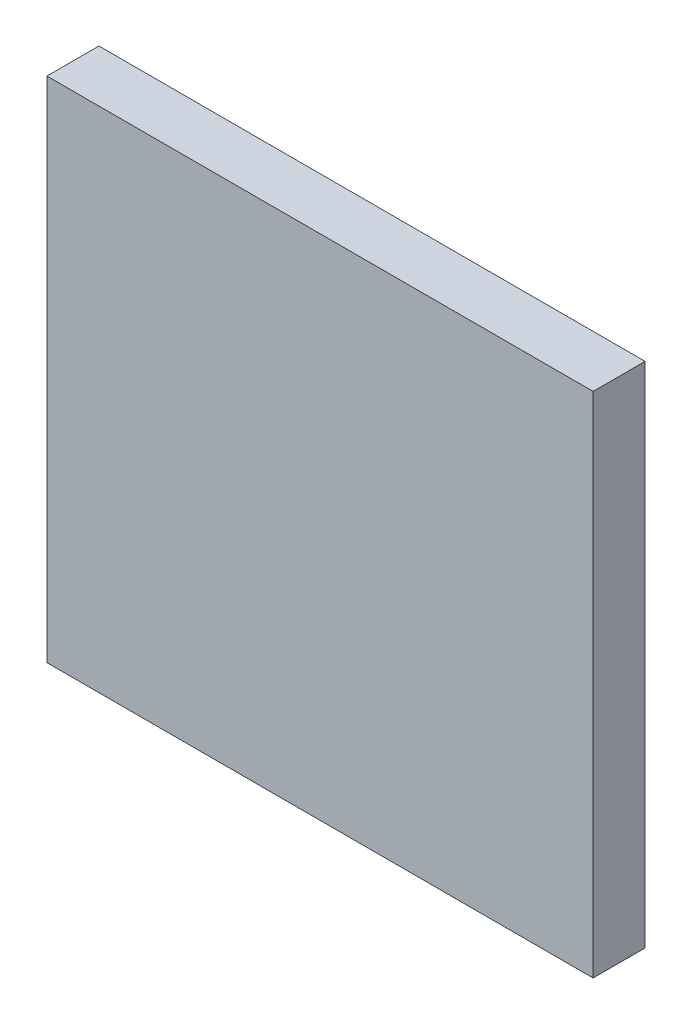
ISO-10303-21;
HEADER;
FILE_DESCRIPTION(('STEP AP214'),'2;1');
FILE_NAME('part.step','',(''),(''),'','','');
FILE_SCHEMA(('AUTOMOTIVE_DESIGN { 1 0 10303 214 1 1 1 1 }'));
ENDSEC;
DATA;
#1=APPLICATION_CONTEXT('core data for automotive mechanical design processes');
#2=APPLICATION_PROTOCOL_DEFINITION('international standard','automotive_design',2000,#1);
#3=PRODUCT_CONTEXT('',#1,'mechanical');
#4=PRODUCT('Part','Part','',(#3));
#5=PRODUCT_RELATED_PRODUCT_CATEGORY('part','',(#4));
#6=PRODUCT_DEFINITION_FORMATION('','',#4);
#7=PRODUCT_DEFINITION_CONTEXT('part definition',#1,'design');
#8=PRODUCT_DEFINITION('design','',#6,#7);
#9=PRODUCT_DEFINITION_SHAPE('','',#8);
#10=(LENGTH_UNIT() NAMED_UNIT(*) SI_UNIT(.MILLI.,.METRE.));
#11=(NAMED_UNIT(*) PLANE_ANGLE_UNIT() SI_UNIT($,.RADIAN.));
#12=(NAMED_UNIT(*) SI_UNIT($,.STERADIAN.) SOLID_ANGLE_UNIT());
#13=UNCERTAINTY_MEASURE_WITH_UNIT(LENGTH_MEASURE(1.E-05),#10,'distance_accuracy_value','');
#14=(GEOMETRIC_REPRESENTATION_CONTEXT(3) GLOBAL_UNCERTAINTY_ASSIGNED_CONTEXT((#13)) GLOBAL_UNIT_ASSIGNED_CONTEXT((#10,
#11,#12)) REPRESENTATION_CONTEXT('',''));
#15=CARTESIAN_POINT('',(0.,0.,0.));
#16=DIRECTION('',(0.,0.,1.));
#17=DIRECTION('',(1.,0.,0.));
#18=AXIS2_PLACEMENT_3D('',#15,#16,#17);
#19=CARTESIAN_POINT('',(-0.46482,0.,1.3));
#20=DIRECTION('',(0.,0.,1.));
#21=DIRECTION('',(1.,0.,0.));
#22=AXIS2_PLACEMENT_3D('',#19,#20,#21);
#23=PLANE('',#22);
#24=DIRECTION('',(1.,0.,0.));
#25=VECTOR('',#24,1.);
#26=CARTESIAN_POINT('',(-7.29234,-6.35,1.3));
#27=LINE('',#26,#25);
#28=CARTESIAN_POINT('',(-7.29234,-6.35,1.3));
#29=VERTEX_POINT('',#28);
#30=CARTESIAN_POINT('',(6.3627,-6.35,1.3));
#31=VERTEX_POINT('',#30);
#32=EDGE_CURVE('E94',#29,#31,#27,.T.);
#33=ORIENTED_EDGE('',*,*,#32,.T.);
#34=DIRECTION('',(0.,1.,0.));
#35=VECTOR('',#34,1.);
#36=CARTESIAN_POINT('',(6.3627,-6.35,1.3));
#37=LINE('',#36,#35);
#38=CARTESIAN_POINT('',(6.3627,6.35,1.3));
#39=VERTEX_POINT('',#38);
#40=EDGE_CURVE('E73',#31,#39,#37,.T.);
#41=ORIENTED_EDGE('',*,*,#40,.T.);
#42=DIRECTION('',(-1.,0.,0.));
#43=VECTOR('',#42,1.);
#44=CARTESIAN_POINT('',(6.3627,6.35,1.3));
#45=LINE('',#44,#43);
#46=CARTESIAN_POINT('',(-7.29234,6.35,1.3));
#47=VERTEX_POINT('',#46);
#48=EDGE_CURVE('E20',#39,#47,#45,.T.);
#49=ORIENTED_EDGE('',*,*,#48,.T.);
#50=DIRECTION('',(0.,-1.,0.));
#51=VECTOR('',#50,1.);
#52=CARTESIAN_POINT('',(-7.29234,6.35,1.3));
#53=LINE('',#52,#51);
#54=EDGE_CURVE('E11',#47,#29,#53,.T.);
#55=ORIENTED_EDGE('',*,*,#54,.T.);
#56=EDGE_LOOP('',(#33,#41,#49,#55));
#57=FACE_BOUND('',#56,.T.);
#58=ADVANCED_FACE('F16',(#57),#23,.T.);
#59=CARTESIAN_POINT('',(-0.46482,0.,0.));
#60=DIRECTION('',(0.,0.,1.));
#61=DIRECTION('',(1.,0.,0.));
#62=AXIS2_PLACEMENT_3D('',#59,#60,#61);
#63=PLANE('',#62);
#64=DIRECTION('',(1.,0.,0.));
#65=VECTOR('',#64,1.);
#66=CARTESIAN_POINT('',(-7.29234,-6.35,0.));
#67=LINE('',#66,#65);
#68=CARTESIAN_POINT('',(-7.29234,-6.35,0.));
#69=VERTEX_POINT('',#68);
#70=CARTESIAN_POINT('',(6.3627,-6.35,0.));
#71=VERTEX_POINT('',#70);
#72=EDGE_CURVE('E105',#69,#71,#67,.T.);
#73=ORIENTED_EDGE('',*,*,#72,.F.);
#74=DIRECTION('',(0.,-1.,0.));
#75=VECTOR('',#74,1.);
#76=CARTESIAN_POINT('',(-7.29234,6.35,0.));
#77=LINE('',#76,#75);
#78=CARTESIAN_POINT('',(-7.29234,6.35,0.));
#79=VERTEX_POINT('',#78);
#80=EDGE_CURVE('E27',#79,#69,#77,.T.);
#81=ORIENTED_EDGE('',*,*,#80,.F.);
#82=DIRECTION('',(-1.,0.,0.));
#83=VECTOR('',#82,1.);
#84=CARTESIAN_POINT('',(6.3627,6.35,0.));
#85=LINE('',#84,#83);
#86=CARTESIAN_POINT('',(6.3627,6.35,0.));
#87=VERTEX_POINT('',#86);
#88=EDGE_CURVE('E78',#87,#79,#85,.T.);
#89=ORIENTED_EDGE('',*,*,#88,.F.);
#90=DIRECTION('',(0.,1.,0.));
#91=VECTOR('',#90,1.);
#92=CARTESIAN_POINT('',(6.3627,-6.35,0.));
#93=LINE('',#92,#91);
#94=EDGE_CURVE('E65',#71,#87,#93,.T.);
#95=ORIENTED_EDGE('',*,*,#94,.F.);
#96=EDGE_LOOP('',(#73,#81,#89,#95));
#97=FACE_BOUND('',#96,.T.);
#98=ADVANCED_FACE('F18',(#97),#63,.F.);
#99=CARTESIAN_POINT('',(-7.29234,6.35,0.));
#100=DIRECTION('',(1.,0.,0.));
#101=DIRECTION('',(0.,1.,0.));
#102=AXIS2_PLACEMENT_3D('',#99,#100,#101);
#103=PLANE('',#102);
#104=DIRECTION('',(0.,0.,1.));
#105=VECTOR('',#104,1.);
#106=CARTESIAN_POINT('',(-7.29234,6.35,0.));
#107=LINE('',#106,#105);
#108=EDGE_CURVE('E83',#79,#47,#107,.T.);
#109=ORIENTED_EDGE('',*,*,#108,.F.);
#110=ORIENTED_EDGE('',*,*,#80,.T.);
#111=DIRECTION('',(0.,0.,1.));
#112=VECTOR('',#111,1.);
#113=CARTESIAN_POINT('',(-7.29234,-6.35,0.));
#114=LINE('',#113,#112);
#115=EDGE_CURVE('E103',#69,#29,#114,.T.);
#116=ORIENTED_EDGE('',*,*,#115,.T.);
#117=ORIENTED_EDGE('',*,*,#54,.F.);
#118=EDGE_LOOP('',(#109,#110,#116,#117));
#119=FACE_BOUND('',#118,.T.);
#120=ADVANCED_FACE('F115',(#119),#103,.F.);
#121=CARTESIAN_POINT('',(6.3627,6.35,0.));
#122=DIRECTION('',(0.,-1.,0.));
#123=DIRECTION('',(0.,0.,-1.));
#124=AXIS2_PLACEMENT_3D('',#121,#122,#123);
#125=PLANE('',#124);
#126=DIRECTION('',(0.,0.,1.));
#127=VECTOR('',#126,1.);
#128=CARTESIAN_POINT('',(6.3627,6.35,0.));
#129=LINE('',#128,#127);
#130=EDGE_CURVE('E85',#87,#39,#129,.T.);
#131=ORIENTED_EDGE('',*,*,#130,.F.);
#132=ORIENTED_EDGE('',*,*,#88,.T.);
#133=ORIENTED_EDGE('',*,*,#108,.T.);
#134=ORIENTED_EDGE('',*,*,#48,.F.);
#135=EDGE_LOOP('',(#131,#132,#133,#134));
#136=FACE_BOUND('',#135,.T.);
#137=ADVANCED_FACE('F86',(#136),#125,.F.);
#138=CARTESIAN_POINT('',(6.3627,-6.35,0.));
#139=DIRECTION('',(-1.,0.,0.));
#140=DIRECTION('',(0.,0.,1.));
#141=AXIS2_PLACEMENT_3D('',#138,#139,#140);
#142=PLANE('',#141);
#143=DIRECTION('',(0.,0.,1.));
#144=VECTOR('',#143,1.);
#145=CARTESIAN_POINT('',(6.3627,-6.35,0.));
#146=LINE('',#145,#144);
#147=EDGE_CURVE('E91',#71,#31,#146,.T.);
#148=ORIENTED_EDGE('',*,*,#147,.F.);
#149=ORIENTED_EDGE('',*,*,#94,.T.);
#150=ORIENTED_EDGE('',*,*,#130,.T.);
#151=ORIENTED_EDGE('',*,*,#40,.F.);
#152=EDGE_LOOP('',(#148,#149,#150,#151));
#153=FACE_BOUND('',#152,.T.);
#154=ADVANCED_FACE('F89',(#153),#142,.F.);
#155=CARTESIAN_POINT('',(-7.29234,-6.35,0.));
#156=DIRECTION('',(0.,1.,0.));
#157=DIRECTION('',(1.,0.,0.));
#158=AXIS2_PLACEMENT_3D('',#155,#156,#157);
#159=PLANE('',#158);
#160=ORIENTED_EDGE('',*,*,#115,.F.);
#161=ORIENTED_EDGE('',*,*,#72,.T.);
#162=ORIENTED_EDGE('',*,*,#147,.T.);
#163=ORIENTED_EDGE('',*,*,#32,.F.);
#164=EDGE_LOOP('',(#160,#161,#162,#163));
#165=FACE_BOUND('',#164,.T.);
#166=ADVANCED_FACE('F117',(#165),#159,.F.);
#167=CLOSED_SHELL('',(#58,#98,#120,#137,#154,#166));
#168=MANIFOLD_SOLID_BREP('B1',#167);
#169=ADVANCED_BREP_SHAPE_REPRESENTATION('',(#18,#168),#14);
#170=SHAPE_DEFINITION_REPRESENTATION(#9,#169);
ENDSEC;
END-ISO-10303-21;
